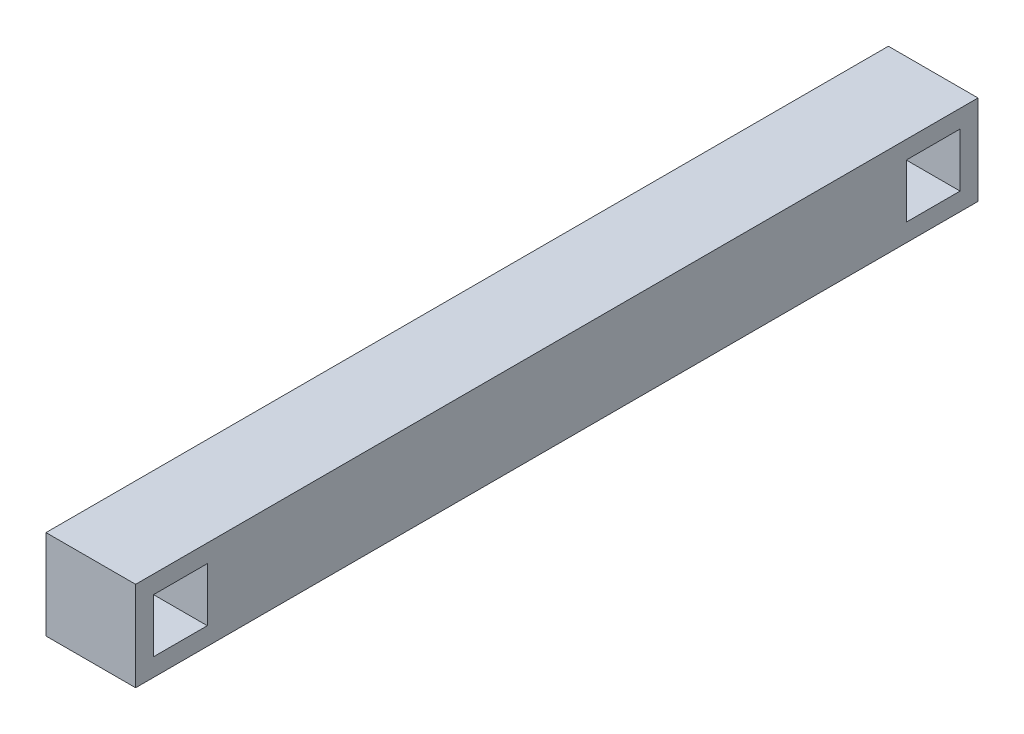
ISO-10303-21;
HEADER;
FILE_DESCRIPTION(('STEP AP214'),'2;1');
FILE_NAME('part.step','',(''),(''),'','','');
FILE_SCHEMA(('AUTOMOTIVE_DESIGN { 1 0 10303 214 1 1 1 1 }'));
ENDSEC;
DATA;
#1=APPLICATION_CONTEXT('core data for automotive mechanical design processes');
#2=APPLICATION_PROTOCOL_DEFINITION('international standard','automotive_design',2000,#1);
#3=PRODUCT_CONTEXT('',#1,'mechanical');
#4=PRODUCT('Part','Part','',(#3));
#5=PRODUCT_RELATED_PRODUCT_CATEGORY('part','',(#4));
#6=PRODUCT_DEFINITION_FORMATION('','',#4);
#7=PRODUCT_DEFINITION_CONTEXT('part definition',#1,'design');
#8=PRODUCT_DEFINITION('design','',#6,#7);
#9=PRODUCT_DEFINITION_SHAPE('','',#8);
#10=(LENGTH_UNIT() NAMED_UNIT(*) SI_UNIT(.MILLI.,.METRE.));
#11=(NAMED_UNIT(*) PLANE_ANGLE_UNIT() SI_UNIT($,.RADIAN.));
#12=(NAMED_UNIT(*) SI_UNIT($,.STERADIAN.) SOLID_ANGLE_UNIT());
#13=UNCERTAINTY_MEASURE_WITH_UNIT(LENGTH_MEASURE(1.E-05),#10,'distance_accuracy_value','');
#14=(GEOMETRIC_REPRESENTATION_CONTEXT(3) GLOBAL_UNCERTAINTY_ASSIGNED_CONTEXT((#13)) GLOBAL_UNIT_ASSIGNED_CONTEXT((#10,
#11,#12)) REPRESENTATION_CONTEXT('',''));
#15=CARTESIAN_POINT('',(0.,0.,0.));
#16=DIRECTION('',(0.,0.,1.));
#17=DIRECTION('',(1.,0.,0.));
#18=AXIS2_PLACEMENT_3D('',#15,#16,#17);
#19=CARTESIAN_POINT('',(0.,0.,47.));
#20=DIRECTION('',(1.,0.,0.));
#21=DIRECTION('',(0.,0.,-1.));
#22=AXIS2_PLACEMENT_3D('',#19,#20,#21);
#23=PLANE('',#22);
#24=DIRECTION('',(0.,0.,1.));
#25=VECTOR('',#24,1.);
#26=CARTESIAN_POINT('',(0.,4.,47.));
#27=LINE('',#26,#25);
#28=CARTESIAN_POINT('',(0.,4.,43.));
#29=VERTEX_POINT('',#28);
#30=CARTESIAN_POINT('',(0.,4.,46.));
#31=VERTEX_POINT('',#30);
#32=EDGE_CURVE('E184',#29,#31,#27,.T.);
#33=ORIENTED_EDGE('',*,*,#32,.T.);
#34=DIRECTION('',(0.,-1.,0.));
#35=VECTOR('',#34,1.);
#36=CARTESIAN_POINT('',(0.,0.,46.));
#37=LINE('',#36,#35);
#38=CARTESIAN_POINT('',(0.,1.,46.));
#39=VERTEX_POINT('',#38);
#40=EDGE_CURVE('E187',#31,#39,#37,.T.);
#41=ORIENTED_EDGE('',*,*,#40,.T.);
#42=DIRECTION('',(0.,0.,-1.));
#43=VECTOR('',#42,1.);
#44=CARTESIAN_POINT('',(0.,1.,47.));
#45=LINE('',#44,#43);
#46=CARTESIAN_POINT('',(0.,1.,43.));
#47=VERTEX_POINT('',#46);
#48=EDGE_CURVE('E181',#39,#47,#45,.T.);
#49=ORIENTED_EDGE('',*,*,#48,.T.);
#50=DIRECTION('',(0.,1.,0.));
#51=VECTOR('',#50,1.);
#52=CARTESIAN_POINT('',(0.,0.,43.));
#53=LINE('',#52,#51);
#54=EDGE_CURVE('E125',#47,#29,#53,.T.);
#55=ORIENTED_EDGE('',*,*,#54,.T.);
#56=EDGE_LOOP('',(#33,#41,#49,#55));
#57=FACE_BOUND('',#56,.T.);
#58=DIRECTION('',(0.,0.,1.));
#59=VECTOR('',#58,1.);
#60=CARTESIAN_POINT('',(0.,4.,47.));
#61=LINE('',#60,#59);
#62=CARTESIAN_POINT('',(0.,4.,1.));
#63=VERTEX_POINT('',#62);
#64=CARTESIAN_POINT('',(0.,4.,4.));
#65=VERTEX_POINT('',#64);
#66=EDGE_CURVE('E175',#63,#65,#61,.T.);
#67=ORIENTED_EDGE('',*,*,#66,.T.);
#68=DIRECTION('',(0.,-1.,0.));
#69=VECTOR('',#68,1.);
#70=CARTESIAN_POINT('',(0.,0.,4.));
#71=LINE('',#70,#69);
#72=CARTESIAN_POINT('',(0.,1.,4.));
#73=VERTEX_POINT('',#72);
#74=EDGE_CURVE('E178',#65,#73,#71,.T.);
#75=ORIENTED_EDGE('',*,*,#74,.T.);
#76=DIRECTION('',(0.,0.,-1.));
#77=VECTOR('',#76,1.);
#78=CARTESIAN_POINT('',(0.,1.,47.));
#79=LINE('',#78,#77);
#80=CARTESIAN_POINT('',(0.,1.,1.));
#81=VERTEX_POINT('',#80);
#82=EDGE_CURVE('E149',#73,#81,#79,.T.);
#83=ORIENTED_EDGE('',*,*,#82,.T.);
#84=DIRECTION('',(0.,1.,0.));
#85=VECTOR('',#84,1.);
#86=CARTESIAN_POINT('',(0.,0.,1.));
#87=LINE('',#86,#85);
#88=EDGE_CURVE('E172',#81,#63,#87,.T.);
#89=ORIENTED_EDGE('',*,*,#88,.T.);
#90=EDGE_LOOP('',(#67,#75,#83,#89));
#91=FACE_BOUND('',#90,.T.);
#92=DIRECTION('',(0.,-1.,0.));
#93=VECTOR('',#92,1.);
#94=CARTESIAN_POINT('',(0.,0.,0.));
#95=LINE('',#94,#93);
#96=CARTESIAN_POINT('',(0.,5.,0.));
#97=VERTEX_POINT('',#96);
#98=CARTESIAN_POINT('',(0.,0.,0.));
#99=VERTEX_POINT('',#98);
#100=EDGE_CURVE('E190',#97,#99,#95,.T.);
#101=ORIENTED_EDGE('',*,*,#100,.T.);
#102=DIRECTION('',(0.,0.,-1.));
#103=VECTOR('',#102,1.);
#104=CARTESIAN_POINT('',(0.,0.,47.));
#105=LINE('',#104,#103);
#106=CARTESIAN_POINT('',(0.,0.,47.));
#107=VERTEX_POINT('',#106);
#108=EDGE_CURVE('E11',#107,#99,#105,.T.);
#109=ORIENTED_EDGE('',*,*,#108,.F.);
#110=DIRECTION('',(0.,-1.,0.));
#111=VECTOR('',#110,1.);
#112=CARTESIAN_POINT('',(0.,0.,47.));
#113=LINE('',#112,#111);
#114=CARTESIAN_POINT('',(0.,5.,47.));
#115=VERTEX_POINT('',#114);
#116=EDGE_CURVE('E191',#115,#107,#113,.T.);
#117=ORIENTED_EDGE('',*,*,#116,.F.);
#118=DIRECTION('',(0.,0.,-1.));
#119=VECTOR('',#118,1.);
#120=CARTESIAN_POINT('',(0.,5.,47.));
#121=LINE('',#120,#119);
#122=EDGE_CURVE('E201',#115,#97,#121,.T.);
#123=ORIENTED_EDGE('',*,*,#122,.T.);
#124=EDGE_LOOP('',(#101,#109,#117,#123));
#125=FACE_BOUND('',#124,.T.);
#126=ADVANCED_FACE('F32',(#57,#91,#125),#23,.F.);
#127=CARTESIAN_POINT('',(0.,0.,47.));
#128=DIRECTION('',(0.,1.,0.));
#129=DIRECTION('',(0.,0.,1.));
#130=AXIS2_PLACEMENT_3D('',#127,#128,#129);
#131=PLANE('',#130);
#132=DIRECTION('',(1.,0.,0.));
#133=VECTOR('',#132,1.);
#134=CARTESIAN_POINT('',(0.,0.,0.));
#135=LINE('',#134,#133);
#136=CARTESIAN_POINT('',(5.,0.,0.));
#137=VERTEX_POINT('',#136);
#138=EDGE_CURVE('E204',#99,#137,#135,.T.);
#139=ORIENTED_EDGE('',*,*,#138,.T.);
#140=DIRECTION('',(0.,0.,-1.));
#141=VECTOR('',#140,1.);
#142=CARTESIAN_POINT('',(5.,0.,47.));
#143=LINE('',#142,#141);
#144=CARTESIAN_POINT('',(5.,0.,47.));
#145=VERTEX_POINT('',#144);
#146=EDGE_CURVE('E39',#145,#137,#143,.T.);
#147=ORIENTED_EDGE('',*,*,#146,.F.);
#148=DIRECTION('',(1.,0.,0.));
#149=VECTOR('',#148,1.);
#150=CARTESIAN_POINT('',(0.,0.,47.));
#151=LINE('',#150,#149);
#152=EDGE_CURVE('E194',#107,#145,#151,.T.);
#153=ORIENTED_EDGE('',*,*,#152,.F.);
#154=ORIENTED_EDGE('',*,*,#108,.T.);
#155=EDGE_LOOP('',(#139,#147,#153,#154));
#156=FACE_BOUND('',#155,.T.);
#157=ADVANCED_FACE('F233',(#156),#131,.F.);
#158=CARTESIAN_POINT('',(5.,0.,47.));
#159=DIRECTION('',(-1.,0.,0.));
#160=DIRECTION('',(0.,0.,1.));
#161=AXIS2_PLACEMENT_3D('',#158,#159,#160);
#162=PLANE('',#161);
#163=DIRECTION('',(0.,0.,-1.));
#164=VECTOR('',#163,1.);
#165=CARTESIAN_POINT('',(5.,1.,46.));
#166=LINE('',#165,#164);
#167=CARTESIAN_POINT('',(5.,1.,46.));
#168=VERTEX_POINT('',#167);
#169=CARTESIAN_POINT('',(5.,1.,43.));
#170=VERTEX_POINT('',#169);
#171=EDGE_CURVE('E132',#168,#170,#166,.T.);
#172=ORIENTED_EDGE('',*,*,#171,.F.);
#173=DIRECTION('',(0.,-1.,0.));
#174=VECTOR('',#173,1.);
#175=CARTESIAN_POINT('',(5.,1.,46.));
#176=LINE('',#175,#174);
#177=CARTESIAN_POINT('',(5.,4.,46.));
#178=VERTEX_POINT('',#177);
#179=EDGE_CURVE('E137',#178,#168,#176,.T.);
#180=ORIENTED_EDGE('',*,*,#179,.F.);
#181=DIRECTION('',(0.,0.,1.));
#182=VECTOR('',#181,1.);
#183=CARTESIAN_POINT('',(5.,4.,46.));
#184=LINE('',#183,#182);
#185=CARTESIAN_POINT('',(5.,4.,43.));
#186=VERTEX_POINT('',#185);
#187=EDGE_CURVE('E142',#186,#178,#184,.T.);
#188=ORIENTED_EDGE('',*,*,#187,.F.);
#189=DIRECTION('',(0.,1.,0.));
#190=VECTOR('',#189,1.);
#191=CARTESIAN_POINT('',(5.,1.,43.));
#192=LINE('',#191,#190);
#193=EDGE_CURVE('E122',#170,#186,#192,.T.);
#194=ORIENTED_EDGE('',*,*,#193,.F.);
#195=EDGE_LOOP('',(#172,#180,#188,#194));
#196=FACE_BOUND('',#195,.T.);
#197=DIRECTION('',(0.,0.,-1.));
#198=VECTOR('',#197,1.);
#199=CARTESIAN_POINT('',(5.,1.,4.));
#200=LINE('',#199,#198);
#201=CARTESIAN_POINT('',(5.,1.,4.));
#202=VERTEX_POINT('',#201);
#203=CARTESIAN_POINT('',(5.,1.,1.));
#204=VERTEX_POINT('',#203);
#205=EDGE_CURVE('E154',#202,#204,#200,.T.);
#206=ORIENTED_EDGE('',*,*,#205,.F.);
#207=DIRECTION('',(0.,-1.,0.));
#208=VECTOR('',#207,1.);
#209=CARTESIAN_POINT('',(5.,1.,4.));
#210=LINE('',#209,#208);
#211=CARTESIAN_POINT('',(5.,4.,4.));
#212=VERTEX_POINT('',#211);
#213=EDGE_CURVE('E152',#212,#202,#210,.T.);
#214=ORIENTED_EDGE('',*,*,#213,.F.);
#215=DIRECTION('',(0.,0.,1.));
#216=VECTOR('',#215,1.);
#217=CARTESIAN_POINT('',(5.,4.,4.));
#218=LINE('',#217,#216);
#219=CARTESIAN_POINT('',(5.,4.,1.));
#220=VERTEX_POINT('',#219);
#221=EDGE_CURVE('E159',#220,#212,#218,.T.);
#222=ORIENTED_EDGE('',*,*,#221,.F.);
#223=DIRECTION('',(0.,1.,0.));
#224=VECTOR('',#223,1.);
#225=CARTESIAN_POINT('',(5.,1.,1.));
#226=LINE('',#225,#224);
#227=EDGE_CURVE('E156',#204,#220,#226,.T.);
#228=ORIENTED_EDGE('',*,*,#227,.F.);
#229=EDGE_LOOP('',(#206,#214,#222,#228));
#230=FACE_BOUND('',#229,.T.);
#231=DIRECTION('',(0.,1.,0.));
#232=VECTOR('',#231,1.);
#233=CARTESIAN_POINT('',(5.,0.,0.));
#234=LINE('',#233,#232);
#235=CARTESIAN_POINT('',(5.,5.,0.));
#236=VERTEX_POINT('',#235);
#237=EDGE_CURVE('E206',#137,#236,#234,.T.);
#238=ORIENTED_EDGE('',*,*,#237,.T.);
#239=DIRECTION('',(0.,0.,-1.));
#240=VECTOR('',#239,1.);
#241=CARTESIAN_POINT('',(5.,5.,47.));
#242=LINE('',#241,#240);
#243=CARTESIAN_POINT('',(5.,5.,47.));
#244=VERTEX_POINT('',#243);
#245=EDGE_CURVE('E211',#244,#236,#242,.T.);
#246=ORIENTED_EDGE('',*,*,#245,.F.);
#247=DIRECTION('',(0.,1.,0.));
#248=VECTOR('',#247,1.);
#249=CARTESIAN_POINT('',(5.,0.,47.));
#250=LINE('',#249,#248);
#251=EDGE_CURVE('E197',#145,#244,#250,.T.);
#252=ORIENTED_EDGE('',*,*,#251,.F.);
#253=ORIENTED_EDGE('',*,*,#146,.T.);
#254=EDGE_LOOP('',(#238,#246,#252,#253));
#255=FACE_BOUND('',#254,.T.);
#256=ADVANCED_FACE('F139',(#196,#230,#255),#162,.F.);
#257=CARTESIAN_POINT('',(0.,5.,47.));
#258=DIRECTION('',(0.,-1.,0.));
#259=DIRECTION('',(0.,0.,-1.));
#260=AXIS2_PLACEMENT_3D('',#257,#258,#259);
#261=PLANE('',#260);
#262=DIRECTION('',(-1.,0.,0.));
#263=VECTOR('',#262,1.);
#264=CARTESIAN_POINT('',(0.,5.,0.));
#265=LINE('',#264,#263);
#266=EDGE_CURVE('E195',#236,#97,#265,.T.);
#267=ORIENTED_EDGE('',*,*,#266,.T.);
#268=ORIENTED_EDGE('',*,*,#122,.F.);
#269=DIRECTION('',(-1.,0.,0.));
#270=VECTOR('',#269,1.);
#271=CARTESIAN_POINT('',(0.,5.,47.));
#272=LINE('',#271,#270);
#273=EDGE_CURVE('E199',#244,#115,#272,.T.);
#274=ORIENTED_EDGE('',*,*,#273,.F.);
#275=ORIENTED_EDGE('',*,*,#245,.T.);
#276=EDGE_LOOP('',(#267,#268,#274,#275));
#277=FACE_BOUND('',#276,.T.);
#278=ADVANCED_FACE('F226',(#277),#261,.F.);
#279=CARTESIAN_POINT('',(0.,0.,47.));
#280=DIRECTION('',(0.,0.,-1.));
#281=DIRECTION('',(-1.,0.,0.));
#282=AXIS2_PLACEMENT_3D('',#279,#280,#281);
#283=PLANE('',#282);
#284=ORIENTED_EDGE('',*,*,#116,.T.);
#285=ORIENTED_EDGE('',*,*,#152,.T.);
#286=ORIENTED_EDGE('',*,*,#251,.T.);
#287=ORIENTED_EDGE('',*,*,#273,.T.);
#288=EDGE_LOOP('',(#284,#285,#286,#287));
#289=FACE_BOUND('',#288,.T.);
#290=ADVANCED_FACE('F232',(#289),#283,.F.);
#291=CARTESIAN_POINT('',(0.,0.,0.));
#292=DIRECTION('',(0.,0.,-1.));
#293=DIRECTION('',(-1.,0.,0.));
#294=AXIS2_PLACEMENT_3D('',#291,#292,#293);
#295=PLANE('',#294);
#296=ORIENTED_EDGE('',*,*,#100,.F.);
#297=ORIENTED_EDGE('',*,*,#266,.F.);
#298=ORIENTED_EDGE('',*,*,#237,.F.);
#299=ORIENTED_EDGE('',*,*,#138,.F.);
#300=EDGE_LOOP('',(#296,#297,#298,#299));
#301=FACE_BOUND('',#300,.T.);
#302=ADVANCED_FACE('F223',(#301),#295,.T.);
#303=CARTESIAN_POINT('',(-42.,1.,4.));
#304=DIRECTION('',(0.,0.,1.));
#305=DIRECTION('',(1.,0.,0.));
#306=AXIS2_PLACEMENT_3D('',#303,#304,#305);
#307=PLANE('',#306);
#308=DIRECTION('',(1.,0.,0.));
#309=VECTOR('',#308,1.);
#310=CARTESIAN_POINT('',(-42.,4.,4.));
#311=LINE('',#310,#309);
#312=EDGE_CURVE('E163',#65,#212,#311,.T.);
#313=ORIENTED_EDGE('',*,*,#312,.T.);
#314=ORIENTED_EDGE('',*,*,#213,.T.);
#315=DIRECTION('',(1.,0.,0.));
#316=VECTOR('',#315,1.);
#317=CARTESIAN_POINT('',(-42.,1.,4.));
#318=LINE('',#317,#316);
#319=EDGE_CURVE('E162',#73,#202,#318,.T.);
#320=ORIENTED_EDGE('',*,*,#319,.F.);
#321=ORIENTED_EDGE('',*,*,#74,.F.);
#322=EDGE_LOOP('',(#313,#314,#320,#321));
#323=FACE_BOUND('',#322,.T.);
#324=ADVANCED_FACE('F246',(#323),#307,.F.);
#325=CARTESIAN_POINT('',(-42.,4.,4.));
#326=DIRECTION('',(0.,1.,0.));
#327=DIRECTION('',(0.,0.,1.));
#328=AXIS2_PLACEMENT_3D('',#325,#326,#327);
#329=PLANE('',#328);
#330=DIRECTION('',(1.,0.,0.));
#331=VECTOR('',#330,1.);
#332=CARTESIAN_POINT('',(-42.,4.,1.));
#333=LINE('',#332,#331);
#334=EDGE_CURVE('E165',#63,#220,#333,.T.);
#335=ORIENTED_EDGE('',*,*,#334,.T.);
#336=ORIENTED_EDGE('',*,*,#221,.T.);
#337=ORIENTED_EDGE('',*,*,#312,.F.);
#338=ORIENTED_EDGE('',*,*,#66,.F.);
#339=EDGE_LOOP('',(#335,#336,#337,#338));
#340=FACE_BOUND('',#339,.T.);
#341=ADVANCED_FACE('F251',(#340),#329,.F.);
#342=CARTESIAN_POINT('',(-42.,1.,1.));
#343=DIRECTION('',(0.,0.,-1.));
#344=DIRECTION('',(-1.,0.,0.));
#345=AXIS2_PLACEMENT_3D('',#342,#343,#344);
#346=PLANE('',#345);
#347=DIRECTION('',(1.,0.,0.));
#348=VECTOR('',#347,1.);
#349=CARTESIAN_POINT('',(-42.,1.,1.));
#350=LINE('',#349,#348);
#351=EDGE_CURVE('E54',#81,#204,#350,.T.);
#352=ORIENTED_EDGE('',*,*,#351,.T.);
#353=ORIENTED_EDGE('',*,*,#227,.T.);
#354=ORIENTED_EDGE('',*,*,#334,.F.);
#355=ORIENTED_EDGE('',*,*,#88,.F.);
#356=EDGE_LOOP('',(#352,#353,#354,#355));
#357=FACE_BOUND('',#356,.T.);
#358=ADVANCED_FACE('F257',(#357),#346,.F.);
#359=CARTESIAN_POINT('',(-42.,1.,4.));
#360=DIRECTION('',(0.,-1.,0.));
#361=DIRECTION('',(0.,0.,-1.));
#362=AXIS2_PLACEMENT_3D('',#359,#360,#361);
#363=PLANE('',#362);
#364=ORIENTED_EDGE('',*,*,#319,.T.);
#365=ORIENTED_EDGE('',*,*,#205,.T.);
#366=ORIENTED_EDGE('',*,*,#351,.F.);
#367=ORIENTED_EDGE('',*,*,#82,.F.);
#368=EDGE_LOOP('',(#364,#365,#366,#367));
#369=FACE_BOUND('',#368,.T.);
#370=ADVANCED_FACE('F253',(#369),#363,.F.);
#371=CARTESIAN_POINT('',(-42.,1.,46.));
#372=DIRECTION('',(0.,0.,1.));
#373=DIRECTION('',(1.,0.,0.));
#374=AXIS2_PLACEMENT_3D('',#371,#372,#373);
#375=PLANE('',#374);
#376=DIRECTION('',(1.,0.,0.));
#377=VECTOR('',#376,1.);
#378=CARTESIAN_POINT('',(-42.,4.,46.));
#379=LINE('',#378,#377);
#380=EDGE_CURVE('E147',#31,#178,#379,.T.);
#381=ORIENTED_EDGE('',*,*,#380,.T.);
#382=ORIENTED_EDGE('',*,*,#179,.T.);
#383=DIRECTION('',(1.,0.,0.));
#384=VECTOR('',#383,1.);
#385=CARTESIAN_POINT('',(-42.,1.,46.));
#386=LINE('',#385,#384);
#387=EDGE_CURVE('E128',#39,#168,#386,.T.);
#388=ORIENTED_EDGE('',*,*,#387,.F.);
#389=ORIENTED_EDGE('',*,*,#40,.F.);
#390=EDGE_LOOP('',(#381,#382,#388,#389));
#391=FACE_BOUND('',#390,.T.);
#392=ADVANCED_FACE('F256',(#391),#375,.F.);
#393=CARTESIAN_POINT('',(-42.,4.,46.));
#394=DIRECTION('',(0.,1.,0.));
#395=DIRECTION('',(0.,0.,1.));
#396=AXIS2_PLACEMENT_3D('',#393,#394,#395);
#397=PLANE('',#396);
#398=DIRECTION('',(1.,0.,0.));
#399=VECTOR('',#398,1.);
#400=CARTESIAN_POINT('',(-42.,4.,43.));
#401=LINE('',#400,#399);
#402=EDGE_CURVE('E127',#29,#186,#401,.T.);
#403=ORIENTED_EDGE('',*,*,#402,.T.);
#404=ORIENTED_EDGE('',*,*,#187,.T.);
#405=ORIENTED_EDGE('',*,*,#380,.F.);
#406=ORIENTED_EDGE('',*,*,#32,.F.);
#407=EDGE_LOOP('',(#403,#404,#405,#406));
#408=FACE_BOUND('',#407,.T.);
#409=ADVANCED_FACE('F266',(#408),#397,.F.);
#410=CARTESIAN_POINT('',(-42.,1.,43.));
#411=DIRECTION('',(0.,0.,-1.));
#412=DIRECTION('',(-1.,0.,0.));
#413=AXIS2_PLACEMENT_3D('',#410,#411,#412);
#414=PLANE('',#413);
#415=DIRECTION('',(1.,0.,0.));
#416=VECTOR('',#415,1.);
#417=CARTESIAN_POINT('',(-42.,1.,43.));
#418=LINE('',#417,#416);
#419=EDGE_CURVE('E46',#47,#170,#418,.T.);
#420=ORIENTED_EDGE('',*,*,#419,.T.);
#421=ORIENTED_EDGE('',*,*,#193,.T.);
#422=ORIENTED_EDGE('',*,*,#402,.F.);
#423=ORIENTED_EDGE('',*,*,#54,.F.);
#424=EDGE_LOOP('',(#420,#421,#422,#423));
#425=FACE_BOUND('',#424,.T.);
#426=ADVANCED_FACE('F119',(#425),#414,.F.);
#427=CARTESIAN_POINT('',(-42.,1.,46.));
#428=DIRECTION('',(0.,-1.,0.));
#429=DIRECTION('',(0.,0.,-1.));
#430=AXIS2_PLACEMENT_3D('',#427,#428,#429);
#431=PLANE('',#430);
#432=ORIENTED_EDGE('',*,*,#387,.T.);
#433=ORIENTED_EDGE('',*,*,#171,.T.);
#434=ORIENTED_EDGE('',*,*,#419,.F.);
#435=ORIENTED_EDGE('',*,*,#48,.F.);
#436=EDGE_LOOP('',(#432,#433,#434,#435));
#437=FACE_BOUND('',#436,.T.);
#438=ADVANCED_FACE('F133',(#437),#431,.F.);
#439=CLOSED_SHELL('',(#126,#157,#256,#278,#290,#302,#324,#341,#358,#370,#392,#409,#426,#438));
#440=MANIFOLD_SOLID_BREP('B2',#439);
#441=ADVANCED_BREP_SHAPE_REPRESENTATION('',(#18,#440),#14);
#442=SHAPE_DEFINITION_REPRESENTATION(#9,#441);
ENDSEC;
END-ISO-10303-21;
